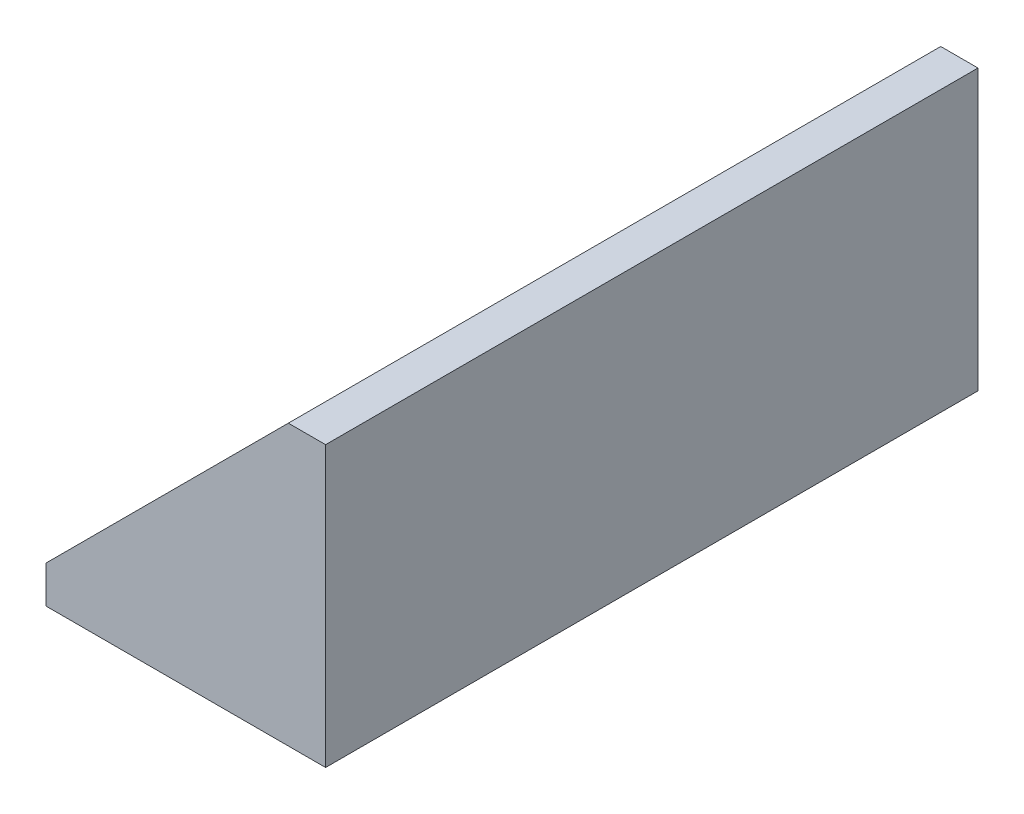
ISO-10303-21;
HEADER;
FILE_DESCRIPTION(('STEP AP214'),'2;1');
FILE_NAME('part.step','',(''),(''),'','','');
FILE_SCHEMA(('AUTOMOTIVE_DESIGN { 1 0 10303 214 1 1 1 1 }'));
ENDSEC;
DATA;
#1=APPLICATION_CONTEXT('core data for automotive mechanical design processes');
#2=APPLICATION_PROTOCOL_DEFINITION('international standard','automotive_design',2000,#1);
#3=PRODUCT_CONTEXT('',#1,'mechanical');
#4=PRODUCT('Part','Part','',(#3));
#5=PRODUCT_RELATED_PRODUCT_CATEGORY('part','',(#4));
#6=PRODUCT_DEFINITION_FORMATION('','',#4);
#7=PRODUCT_DEFINITION_CONTEXT('part definition',#1,'design');
#8=PRODUCT_DEFINITION('design','',#6,#7);
#9=PRODUCT_DEFINITION_SHAPE('','',#8);
#10=(LENGTH_UNIT() NAMED_UNIT(*) SI_UNIT(.MILLI.,.METRE.));
#11=(NAMED_UNIT(*) PLANE_ANGLE_UNIT() SI_UNIT($,.RADIAN.));
#12=(NAMED_UNIT(*) SI_UNIT($,.STERADIAN.) SOLID_ANGLE_UNIT());
#13=UNCERTAINTY_MEASURE_WITH_UNIT(LENGTH_MEASURE(1.E-05),#10,'distance_accuracy_value','');
#14=(GEOMETRIC_REPRESENTATION_CONTEXT(3) GLOBAL_UNCERTAINTY_ASSIGNED_CONTEXT((#13)) GLOBAL_UNIT_ASSIGNED_CONTEXT((#10,
#11,#12)) REPRESENTATION_CONTEXT('',''));
#15=CARTESIAN_POINT('',(0.,0.,0.));
#16=DIRECTION('',(0.,0.,1.));
#17=DIRECTION('',(1.,0.,0.));
#18=AXIS2_PLACEMENT_3D('',#15,#16,#17);
#19=CARTESIAN_POINT('',(26.,4.,70.));
#20=DIRECTION('',(1.,0.,0.));
#21=DIRECTION('',(0.,0.,-1.));
#22=AXIS2_PLACEMENT_3D('',#19,#20,#21);
#23=PLANE('',#22);
#24=DIRECTION('',(0.,-1.,0.));
#25=VECTOR('',#24,1.);
#26=CARTESIAN_POINT('',(26.,30.,33.));
#27=LINE('',#26,#25);
#28=CARTESIAN_POINT('',(26.,30.,33.));
#29=VERTEX_POINT('',#28);
#30=CARTESIAN_POINT('',(26.,4.,33.));
#31=VERTEX_POINT('',#30);
#32=EDGE_CURVE('E133',#29,#31,#27,.T.);
#33=ORIENTED_EDGE('',*,*,#32,.F.);
#34=DIRECTION('',(0.,0.,-1.));
#35=VECTOR('',#34,1.);
#36=CARTESIAN_POINT('',(26.,30.,70.));
#37=LINE('',#36,#35);
#38=CARTESIAN_POINT('',(26.,30.,4.));
#39=VERTEX_POINT('',#38);
#40=EDGE_CURVE('E117',#29,#39,#37,.T.);
#41=ORIENTED_EDGE('',*,*,#40,.T.);
#42=DIRECTION('',(0.,-1.,0.));
#43=VECTOR('',#42,1.);
#44=CARTESIAN_POINT('',(26.,4.,4.));
#45=LINE('',#44,#43);
#46=CARTESIAN_POINT('',(26.,4.,4.));
#47=VERTEX_POINT('',#46);
#48=EDGE_CURVE('E159',#39,#47,#45,.T.);
#49=ORIENTED_EDGE('',*,*,#48,.T.);
#50=DIRECTION('',(0.,0.,-1.));
#51=VECTOR('',#50,1.);
#52=CARTESIAN_POINT('',(26.,4.,70.));
#53=LINE('',#52,#51);
#54=EDGE_CURVE('E134',#31,#47,#53,.T.);
#55=ORIENTED_EDGE('',*,*,#54,.F.);
#56=EDGE_LOOP('',(#33,#41,#49,#55));
#57=FACE_BOUND('',#56,.T.);
#58=ADVANCED_FACE('F33',(#57),#23,.F.);
#59=CARTESIAN_POINT('',(0.,4.,70.));
#60=DIRECTION('',(0.,-1.,0.));
#61=DIRECTION('',(0.,0.,-1.));
#62=AXIS2_PLACEMENT_3D('',#59,#60,#61);
#63=PLANE('',#62);
#64=DIRECTION('',(-1.,0.,0.));
#65=VECTOR('',#64,1.);
#66=CARTESIAN_POINT('',(26.,4.,33.));
#67=LINE('',#66,#65);
#68=CARTESIAN_POINT('',(0.,4.,33.));
#69=VERTEX_POINT('',#68);
#70=EDGE_CURVE('E48',#31,#69,#67,.T.);
#71=ORIENTED_EDGE('',*,*,#70,.F.);
#72=ORIENTED_EDGE('',*,*,#54,.T.);
#73=DIRECTION('',(-1.,0.,0.));
#74=VECTOR('',#73,1.);
#75=CARTESIAN_POINT('',(0.,4.,4.));
#76=LINE('',#75,#74);
#77=CARTESIAN_POINT('',(0.,4.,4.));
#78=VERTEX_POINT('',#77);
#79=EDGE_CURVE('E161',#47,#78,#76,.T.);
#80=ORIENTED_EDGE('',*,*,#79,.T.);
#81=DIRECTION('',(0.,0.,-1.));
#82=VECTOR('',#81,1.);
#83=CARTESIAN_POINT('',(0.,4.,70.));
#84=LINE('',#83,#82);
#85=EDGE_CURVE('E195',#69,#78,#84,.T.);
#86=ORIENTED_EDGE('',*,*,#85,.F.);
#87=EDGE_LOOP('',(#71,#72,#80,#86));
#88=FACE_BOUND('',#87,.T.);
#89=ADVANCED_FACE('F230',(#88),#63,.F.);
#90=CARTESIAN_POINT('',(26.,30.,66.));
#91=VERTEX_POINT('',#90);
#92=CARTESIAN_POINT('',(26.,30.,37.));
#93=VERTEX_POINT('',#92);
#94=EDGE_CURVE('E128',#91,#93,#37,.T.);
#95=ORIENTED_EDGE('',*,*,#94,.T.);
#96=DIRECTION('',(0.,-1.,0.));
#97=VECTOR('',#96,1.);
#98=CARTESIAN_POINT('',(26.,30.,37.));
#99=LINE('',#98,#97);
#100=CARTESIAN_POINT('',(26.,4.,37.));
#101=VERTEX_POINT('',#100);
#102=EDGE_CURVE('E56',#93,#101,#99,.T.);
#103=ORIENTED_EDGE('',*,*,#102,.T.);
#104=CARTESIAN_POINT('',(26.,4.,66.));
#105=VERTEX_POINT('',#104);
#106=EDGE_CURVE('E129',#105,#101,#53,.T.);
#107=ORIENTED_EDGE('',*,*,#106,.F.);
#108=DIRECTION('',(0.,1.,0.));
#109=VECTOR('',#108,1.);
#110=CARTESIAN_POINT('',(26.,4.,66.));
#111=LINE('',#110,#109);
#112=EDGE_CURVE('E174',#105,#91,#111,.T.);
#113=ORIENTED_EDGE('',*,*,#112,.T.);
#114=EDGE_LOOP('',(#95,#103,#107,#113));
#115=FACE_BOUND('',#114,.T.);
#116=ADVANCED_FACE('F240',(#115),#23,.F.);
#117=ORIENTED_EDGE('',*,*,#106,.T.);
#118=DIRECTION('',(-1.,0.,0.));
#119=VECTOR('',#118,1.);
#120=CARTESIAN_POINT('',(26.,4.,37.));
#121=LINE('',#120,#119);
#122=CARTESIAN_POINT('',(0.,4.,37.));
#123=VERTEX_POINT('',#122);
#124=EDGE_CURVE('E137',#101,#123,#121,.T.);
#125=ORIENTED_EDGE('',*,*,#124,.T.);
#126=CARTESIAN_POINT('',(0.,4.,66.));
#127=VERTEX_POINT('',#126);
#128=EDGE_CURVE('E206',#127,#123,#84,.T.);
#129=ORIENTED_EDGE('',*,*,#128,.F.);
#130=DIRECTION('',(1.,0.,0.));
#131=VECTOR('',#130,1.);
#132=CARTESIAN_POINT('',(0.,4.,66.));
#133=LINE('',#132,#131);
#134=EDGE_CURVE('E179',#127,#105,#133,.T.);
#135=ORIENTED_EDGE('',*,*,#134,.T.);
#136=EDGE_LOOP('',(#117,#125,#129,#135));
#137=FACE_BOUND('',#136,.T.);
#138=ADVANCED_FACE('F238',(#137),#63,.F.);
#139=CARTESIAN_POINT('',(0.,0.,70.));
#140=DIRECTION('',(1.,0.,0.));
#141=DIRECTION('',(0.,0.,-1.));
#142=AXIS2_PLACEMENT_3D('',#139,#140,#141);
#143=PLANE('',#142);
#144=DIRECTION('',(0.,-1.,0.));
#145=VECTOR('',#144,1.);
#146=CARTESIAN_POINT('',(0.,0.,0.));
#147=LINE('',#146,#145);
#148=CARTESIAN_POINT('',(0.,4.,0.));
#149=VERTEX_POINT('',#148);
#150=CARTESIAN_POINT('',(0.,0.,0.));
#151=VERTEX_POINT('',#150);
#152=EDGE_CURVE('E182',#149,#151,#147,.T.);
#153=ORIENTED_EDGE('',*,*,#152,.T.);
#154=DIRECTION('',(0.,0.,-1.));
#155=VECTOR('',#154,1.);
#156=CARTESIAN_POINT('',(0.,0.,70.));
#157=LINE('',#156,#155);
#158=CARTESIAN_POINT('',(0.,0.,70.));
#159=VERTEX_POINT('',#158);
#160=EDGE_CURVE('E11',#159,#151,#157,.T.);
#161=ORIENTED_EDGE('',*,*,#160,.F.);
#162=DIRECTION('',(0.,-1.,0.));
#163=VECTOR('',#162,1.);
#164=CARTESIAN_POINT('',(0.,0.,70.));
#165=LINE('',#164,#163);
#166=CARTESIAN_POINT('',(0.,4.,70.));
#167=VERTEX_POINT('',#166);
#168=EDGE_CURVE('E184',#167,#159,#165,.T.);
#169=ORIENTED_EDGE('',*,*,#168,.F.);
#170=EDGE_CURVE('E203',#167,#127,#84,.T.);
#171=ORIENTED_EDGE('',*,*,#170,.T.);
#172=ORIENTED_EDGE('',*,*,#128,.T.);
#173=DIRECTION('',(0.,0.,-1.));
#174=VECTOR('',#173,1.);
#175=CARTESIAN_POINT('',(0.,4.,37.));
#176=LINE('',#175,#174);
#177=EDGE_CURVE('E148',#123,#69,#176,.T.);
#178=ORIENTED_EDGE('',*,*,#177,.T.);
#179=ORIENTED_EDGE('',*,*,#85,.T.);
#180=DIRECTION('',(0.,0.,-1.));
#181=VECTOR('',#180,1.);
#182=CARTESIAN_POINT('',(0.,4.,4.));
#183=LINE('',#182,#181);
#184=EDGE_CURVE('E167',#78,#149,#183,.T.);
#185=ORIENTED_EDGE('',*,*,#184,.T.);
#186=EDGE_LOOP('',(#153,#161,#169,#171,#172,#178,#179,#185));
#187=FACE_BOUND('',#186,.T.);
#188=ADVANCED_FACE('F35',(#187),#143,.F.);
#189=CARTESIAN_POINT('',(0.,0.,70.));
#190=DIRECTION('',(0.,1.,0.));
#191=DIRECTION('',(0.,0.,1.));
#192=AXIS2_PLACEMENT_3D('',#189,#190,#191);
#193=PLANE('',#192);
#194=DIRECTION('',(1.,0.,0.));
#195=VECTOR('',#194,1.);
#196=CARTESIAN_POINT('',(0.,0.,0.));
#197=LINE('',#196,#195);
#198=CARTESIAN_POINT('',(30.,0.,0.));
#199=VERTEX_POINT('',#198);
#200=EDGE_CURVE('E198',#151,#199,#197,.T.);
#201=ORIENTED_EDGE('',*,*,#200,.T.);
#202=DIRECTION('',(0.,0.,-1.));
#203=VECTOR('',#202,1.);
#204=CARTESIAN_POINT('',(30.,0.,70.));
#205=LINE('',#204,#203);
#206=CARTESIAN_POINT('',(30.,0.,70.));
#207=VERTEX_POINT('',#206);
#208=EDGE_CURVE('E41',#207,#199,#205,.T.);
#209=ORIENTED_EDGE('',*,*,#208,.F.);
#210=DIRECTION('',(1.,0.,0.));
#211=VECTOR('',#210,1.);
#212=CARTESIAN_POINT('',(0.,0.,70.));
#213=LINE('',#212,#211);
#214=EDGE_CURVE('E187',#159,#207,#213,.T.);
#215=ORIENTED_EDGE('',*,*,#214,.F.);
#216=ORIENTED_EDGE('',*,*,#160,.T.);
#217=EDGE_LOOP('',(#201,#209,#215,#216));
#218=FACE_BOUND('',#217,.T.);
#219=ADVANCED_FACE('F270',(#218),#193,.F.);
#220=CARTESIAN_POINT('',(30.,0.,70.));
#221=DIRECTION('',(-1.,0.,0.));
#222=DIRECTION('',(0.,0.,1.));
#223=AXIS2_PLACEMENT_3D('',#220,#221,#222);
#224=PLANE('',#223);
#225=DIRECTION('',(0.,1.,0.));
#226=VECTOR('',#225,1.);
#227=CARTESIAN_POINT('',(30.,0.,0.));
#228=LINE('',#227,#226);
#229=CARTESIAN_POINT('',(30.,30.,0.));
#230=VERTEX_POINT('',#229);
#231=EDGE_CURVE('E200',#199,#230,#228,.T.);
#232=ORIENTED_EDGE('',*,*,#231,.T.);
#233=DIRECTION('',(0.,0.,-1.));
#234=VECTOR('',#233,1.);
#235=CARTESIAN_POINT('',(30.,30.,70.));
#236=LINE('',#235,#234);
#237=CARTESIAN_POINT('',(30.,30.,70.));
#238=VERTEX_POINT('',#237);
#239=EDGE_CURVE('E208',#238,#230,#236,.T.);
#240=ORIENTED_EDGE('',*,*,#239,.F.);
#241=DIRECTION('',(0.,1.,0.));
#242=VECTOR('',#241,1.);
#243=CARTESIAN_POINT('',(30.,0.,70.));
#244=LINE('',#243,#242);
#245=EDGE_CURVE('E190',#207,#238,#244,.T.);
#246=ORIENTED_EDGE('',*,*,#245,.F.);
#247=ORIENTED_EDGE('',*,*,#208,.T.);
#248=EDGE_LOOP('',(#232,#240,#246,#247));
#249=FACE_BOUND('',#248,.T.);
#250=ADVANCED_FACE('F215',(#249),#224,.F.);
#251=CARTESIAN_POINT('',(30.,30.,70.));
#252=DIRECTION('',(0.,-1.,0.));
#253=DIRECTION('',(0.,0.,-1.));
#254=AXIS2_PLACEMENT_3D('',#251,#252,#253);
#255=PLANE('',#254);
#256=DIRECTION('',(-1.,0.,0.));
#257=VECTOR('',#256,1.);
#258=CARTESIAN_POINT('',(30.,30.,0.));
#259=LINE('',#258,#257);
#260=CARTESIAN_POINT('',(26.,30.,0.));
#261=VERTEX_POINT('',#260);
#262=EDGE_CURVE('E188',#230,#261,#259,.T.);
#263=ORIENTED_EDGE('',*,*,#262,.T.);
#264=DIRECTION('',(0.,0.,-1.));
#265=VECTOR('',#264,1.);
#266=CARTESIAN_POINT('',(26.,30.,4.));
#267=LINE('',#266,#265);
#268=EDGE_CURVE('E124',#39,#261,#267,.T.);
#269=ORIENTED_EDGE('',*,*,#268,.F.);
#270=ORIENTED_EDGE('',*,*,#40,.F.);
#271=DIRECTION('',(0.,0.,-1.));
#272=VECTOR('',#271,1.);
#273=CARTESIAN_POINT('',(26.,30.,37.));
#274=LINE('',#273,#272);
#275=EDGE_CURVE('E122',#93,#29,#274,.T.);
#276=ORIENTED_EDGE('',*,*,#275,.F.);
#277=ORIENTED_EDGE('',*,*,#94,.F.);
#278=CARTESIAN_POINT('',(26.,30.,70.));
#279=VERTEX_POINT('',#278);
#280=EDGE_CURVE('E131',#279,#91,#37,.T.);
#281=ORIENTED_EDGE('',*,*,#280,.F.);
#282=DIRECTION('',(-1.,0.,0.));
#283=VECTOR('',#282,1.);
#284=CARTESIAN_POINT('',(30.,30.,70.));
#285=LINE('',#284,#283);
#286=EDGE_CURVE('E192',#238,#279,#285,.T.);
#287=ORIENTED_EDGE('',*,*,#286,.F.);
#288=ORIENTED_EDGE('',*,*,#239,.T.);
#289=EDGE_LOOP('',(#263,#269,#270,#276,#277,#281,#287,#288));
#290=FACE_BOUND('',#289,.T.);
#291=ADVANCED_FACE('F119',(#290),#255,.F.);
#292=CARTESIAN_POINT('',(0.,0.,70.));
#293=DIRECTION('',(0.,0.,-1.));
#294=DIRECTION('',(-1.,0.,0.));
#295=AXIS2_PLACEMENT_3D('',#292,#293,#294);
#296=PLANE('',#295);
#297=ORIENTED_EDGE('',*,*,#168,.T.);
#298=ORIENTED_EDGE('',*,*,#214,.T.);
#299=ORIENTED_EDGE('',*,*,#245,.T.);
#300=ORIENTED_EDGE('',*,*,#286,.T.);
#301=DIRECTION('',(-0.707106781186547,-0.707106781186547,0.));
#302=VECTOR('',#301,1.);
#303=CARTESIAN_POINT('',(26.,30.,70.));
#304=LINE('',#303,#302);
#305=EDGE_CURVE('E171',#279,#167,#304,.T.);
#306=ORIENTED_EDGE('',*,*,#305,.T.);
#307=EDGE_LOOP('',(#297,#298,#299,#300,#306));
#308=FACE_BOUND('',#307,.T.);
#309=ADVANCED_FACE('F274',(#308),#296,.F.);
#310=CARTESIAN_POINT('',(0.,0.,0.));
#311=DIRECTION('',(0.,0.,-1.));
#312=DIRECTION('',(-1.,0.,0.));
#313=AXIS2_PLACEMENT_3D('',#310,#311,#312);
#314=PLANE('',#313);
#315=ORIENTED_EDGE('',*,*,#152,.F.);
#316=DIRECTION('',(0.707106781186547,0.707106781186547,0.));
#317=VECTOR('',#316,1.);
#318=CARTESIAN_POINT('',(26.,30.,0.));
#319=LINE('',#318,#317);
#320=EDGE_CURVE('E147',#149,#261,#319,.T.);
#321=ORIENTED_EDGE('',*,*,#320,.T.);
#322=ORIENTED_EDGE('',*,*,#262,.F.);
#323=ORIENTED_EDGE('',*,*,#231,.F.);
#324=ORIENTED_EDGE('',*,*,#200,.F.);
#325=EDGE_LOOP('',(#315,#321,#322,#323,#324));
#326=FACE_BOUND('',#325,.T.);
#327=ADVANCED_FACE('F220',(#326),#314,.T.);
#328=CARTESIAN_POINT('',(26.,30.,66.));
#329=DIRECTION('',(-0.707106781186547,0.707106781186547,0.));
#330=DIRECTION('',(-0.707106781186548,-0.707106781186548,0.));
#331=AXIS2_PLACEMENT_3D('',#328,#329,#330);
#332=PLANE('',#331);
#333=ORIENTED_EDGE('',*,*,#305,.F.);
#334=ORIENTED_EDGE('',*,*,#280,.T.);
#335=DIRECTION('',(-0.707106781186547,-0.707106781186547,0.));
#336=VECTOR('',#335,1.);
#337=CARTESIAN_POINT('',(26.,30.,66.));
#338=LINE('',#337,#336);
#339=EDGE_CURVE('E177',#91,#127,#338,.T.);
#340=ORIENTED_EDGE('',*,*,#339,.T.);
#341=ORIENTED_EDGE('',*,*,#170,.F.);
#342=EDGE_LOOP('',(#333,#334,#340,#341));
#343=FACE_BOUND('',#342,.T.);
#344=ADVANCED_FACE('F245',(#343),#332,.T.);
#345=CARTESIAN_POINT('',(0.,0.,66.));
#346=DIRECTION('',(0.,0.,-1.));
#347=DIRECTION('',(-1.,0.,0.));
#348=AXIS2_PLACEMENT_3D('',#345,#346,#347);
#349=PLANE('',#348);
#350=ORIENTED_EDGE('',*,*,#112,.F.);
#351=ORIENTED_EDGE('',*,*,#134,.F.);
#352=ORIENTED_EDGE('',*,*,#339,.F.);
#353=EDGE_LOOP('',(#350,#351,#352));
#354=FACE_BOUND('',#353,.T.);
#355=ADVANCED_FACE('F247',(#354),#349,.T.);
#356=CARTESIAN_POINT('',(26.,30.,4.));
#357=DIRECTION('',(-0.707106781186547,0.707106781186547,0.));
#358=DIRECTION('',(-0.707106781186548,-0.707106781186548,0.));
#359=AXIS2_PLACEMENT_3D('',#356,#357,#358);
#360=PLANE('',#359);
#361=ORIENTED_EDGE('',*,*,#320,.F.);
#362=ORIENTED_EDGE('',*,*,#184,.F.);
#363=DIRECTION('',(0.707106781186547,0.707106781186547,0.));
#364=VECTOR('',#363,1.);
#365=CARTESIAN_POINT('',(26.,30.,4.));
#366=LINE('',#365,#364);
#367=EDGE_CURVE('E164',#78,#39,#366,.T.);
#368=ORIENTED_EDGE('',*,*,#367,.T.);
#369=ORIENTED_EDGE('',*,*,#268,.T.);
#370=EDGE_LOOP('',(#361,#362,#368,#369));
#371=FACE_BOUND('',#370,.T.);
#372=ADVANCED_FACE('F224',(#371),#360,.T.);
#373=CARTESIAN_POINT('',(0.,0.,4.));
#374=DIRECTION('',(0.,0.,-1.));
#375=DIRECTION('',(-1.,0.,0.));
#376=AXIS2_PLACEMENT_3D('',#373,#374,#375);
#377=PLANE('',#376);
#378=ORIENTED_EDGE('',*,*,#48,.F.);
#379=ORIENTED_EDGE('',*,*,#367,.F.);
#380=ORIENTED_EDGE('',*,*,#79,.F.);
#381=EDGE_LOOP('',(#378,#379,#380));
#382=FACE_BOUND('',#381,.T.);
#383=ADVANCED_FACE('F229',(#382),#377,.F.);
#384=CARTESIAN_POINT('',(0.,4.,37.));
#385=DIRECTION('',(-0.707106781186547,0.707106781186547,0.));
#386=DIRECTION('',(-0.707106781186548,-0.707106781186548,0.));
#387=AXIS2_PLACEMENT_3D('',#384,#385,#386);
#388=PLANE('',#387);
#389=ORIENTED_EDGE('',*,*,#275,.T.);
#390=DIRECTION('',(0.707106781186547,0.707106781186547,0.));
#391=VECTOR('',#390,1.);
#392=CARTESIAN_POINT('',(0.,4.,33.));
#393=LINE('',#392,#391);
#394=EDGE_CURVE('E138',#69,#29,#393,.T.);
#395=ORIENTED_EDGE('',*,*,#394,.F.);
#396=ORIENTED_EDGE('',*,*,#177,.F.);
#397=DIRECTION('',(0.707106781186547,0.707106781186547,0.));
#398=VECTOR('',#397,1.);
#399=CARTESIAN_POINT('',(0.,4.,37.));
#400=LINE('',#399,#398);
#401=EDGE_CURVE('E146',#123,#93,#400,.T.);
#402=ORIENTED_EDGE('',*,*,#401,.T.);
#403=EDGE_LOOP('',(#389,#395,#396,#402));
#404=FACE_BOUND('',#403,.T.);
#405=ADVANCED_FACE('F143',(#404),#388,.T.);
#406=CARTESIAN_POINT('',(0.,0.,37.));
#407=DIRECTION('',(0.,0.,1.));
#408=DIRECTION('',(1.,0.,0.));
#409=AXIS2_PLACEMENT_3D('',#406,#407,#408);
#410=PLANE('',#409);
#411=ORIENTED_EDGE('',*,*,#124,.F.);
#412=ORIENTED_EDGE('',*,*,#102,.F.);
#413=ORIENTED_EDGE('',*,*,#401,.F.);
#414=EDGE_LOOP('',(#411,#412,#413));
#415=FACE_BOUND('',#414,.T.);
#416=ADVANCED_FACE('F236',(#415),#410,.T.);
#417=CARTESIAN_POINT('',(0.,0.,33.));
#418=DIRECTION('',(0.,0.,1.));
#419=DIRECTION('',(1.,0.,0.));
#420=AXIS2_PLACEMENT_3D('',#417,#418,#419);
#421=PLANE('',#420);
#422=ORIENTED_EDGE('',*,*,#70,.T.);
#423=ORIENTED_EDGE('',*,*,#394,.T.);
#424=ORIENTED_EDGE('',*,*,#32,.T.);
#425=EDGE_LOOP('',(#422,#423,#424));
#426=FACE_BOUND('',#425,.T.);
#427=ADVANCED_FACE('F150',(#426),#421,.F.);
#428=CLOSED_SHELL('',(#58,#89,#116,#138,#188,#219,#250,#291,#309,#327,#344,#355,#372,#383,#405,
#416,#427));
#429=MANIFOLD_SOLID_BREP('B2',#428);
#430=ADVANCED_BREP_SHAPE_REPRESENTATION('',(#18,#429),#14);
#431=SHAPE_DEFINITION_REPRESENTATION(#9,#430);
ENDSEC;
END-ISO-10303-21;
